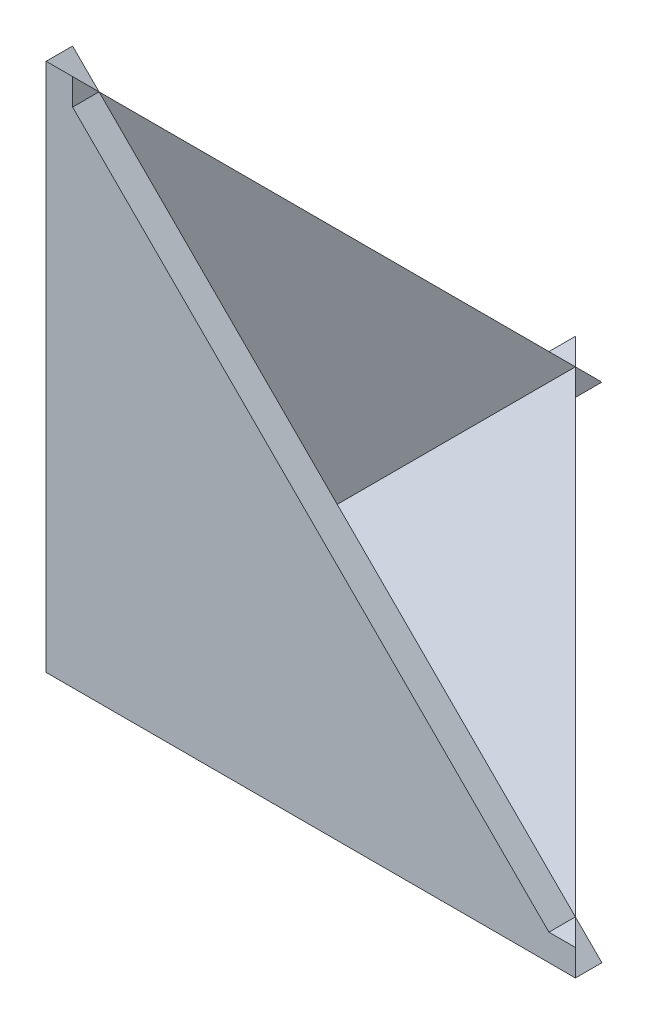
ISO-10303-21;
HEADER;
FILE_DESCRIPTION(('STEP AP214'),'2;1');
FILE_NAME('part.step','',(''),(''),'','','');
FILE_SCHEMA(('AUTOMOTIVE_DESIGN { 1 0 10303 214 1 1 1 1 }'));
ENDSEC;
DATA;
#1=APPLICATION_CONTEXT('core data for automotive mechanical design processes');
#2=APPLICATION_PROTOCOL_DEFINITION('international standard','automotive_design',2000,#1);
#3=PRODUCT_CONTEXT('',#1,'mechanical');
#4=PRODUCT('Part','Part','',(#3));
#5=PRODUCT_RELATED_PRODUCT_CATEGORY('part','',(#4));
#6=PRODUCT_DEFINITION_FORMATION('','',#4);
#7=PRODUCT_DEFINITION_CONTEXT('part definition',#1,'design');
#8=PRODUCT_DEFINITION('design','',#6,#7);
#9=PRODUCT_DEFINITION_SHAPE('','',#8);
#10=(LENGTH_UNIT() NAMED_UNIT(*) SI_UNIT(.MILLI.,.METRE.));
#11=(NAMED_UNIT(*) PLANE_ANGLE_UNIT() SI_UNIT($,.RADIAN.));
#12=(NAMED_UNIT(*) SI_UNIT($,.STERADIAN.) SOLID_ANGLE_UNIT());
#13=UNCERTAINTY_MEASURE_WITH_UNIT(LENGTH_MEASURE(1.E-05),#10,'distance_accuracy_value','');
#14=(GEOMETRIC_REPRESENTATION_CONTEXT(3) GLOBAL_UNCERTAINTY_ASSIGNED_CONTEXT((#13)) GLOBAL_UNIT_ASSIGNED_CONTEXT((#10,
#11,#12)) REPRESENTATION_CONTEXT('',''));
#15=CARTESIAN_POINT('',(0.,0.,0.));
#16=DIRECTION('',(0.,0.,1.));
#17=DIRECTION('',(1.,0.,0.));
#18=AXIS2_PLACEMENT_3D('',#15,#16,#17);
#19=CARTESIAN_POINT('',(10.,0.5,0.));
#20=DIRECTION('',(-0.707106781186547,0.,0.707106781186547));
#21=DIRECTION('',(0.707106781186548,0.,0.707106781186548));
#22=AXIS2_PLACEMENT_3D('',#19,#20,#21);
#23=PLANE('',#22);
#24=DIRECTION('',(0.,-1.,0.));
#25=VECTOR('',#24,1.);
#26=CARTESIAN_POINT('',(0.5,0.5,-9.5));
#27=LINE('',#26,#25);
#28=CARTESIAN_POINT('',(0.5,0.500000000000001,-9.5));
#29=VERTEX_POINT('',#28);
#30=CARTESIAN_POINT('',(0.5,0.,-9.5));
#31=VERTEX_POINT('',#30);
#32=EDGE_CURVE('E135',#29,#31,#27,.T.);
#33=ORIENTED_EDGE('',*,*,#32,.F.);
#34=DIRECTION('',(-0.707106781186548,0.,-0.707106781186548));
#35=VECTOR('',#34,1.);
#36=CARTESIAN_POINT('',(10.,0.5,0.));
#37=LINE('',#36,#35);
#38=CARTESIAN_POINT('',(9.5,0.500000000000001,-0.5));
#39=VERTEX_POINT('',#38);
#40=EDGE_CURVE('E189',#39,#29,#37,.T.);
#41=ORIENTED_EDGE('',*,*,#40,.F.);
#42=DIRECTION('',(0.,1.,0.));
#43=VECTOR('',#42,1.);
#44=CARTESIAN_POINT('',(9.5,0.5,-0.5));
#45=LINE('',#44,#43);
#46=CARTESIAN_POINT('',(9.5,0.,-0.500000000000001));
#47=VERTEX_POINT('',#46);
#48=EDGE_CURVE('E175',#47,#39,#45,.T.);
#49=ORIENTED_EDGE('',*,*,#48,.F.);
#50=DIRECTION('',(-0.707106781186548,0.,-0.707106781186548));
#51=VECTOR('',#50,1.);
#52=CARTESIAN_POINT('',(10.,0.,0.));
#53=LINE('',#52,#51);
#54=EDGE_CURVE('E184',#47,#31,#53,.T.);
#55=ORIENTED_EDGE('',*,*,#54,.T.);
#56=EDGE_LOOP('',(#33,#41,#49,#55));
#57=FACE_BOUND('',#56,.T.);
#58=ADVANCED_FACE('F30',(#57),#23,.F.);
#59=CARTESIAN_POINT('',(0.,0.5,-10.));
#60=DIRECTION('',(0.,1.,0.));
#61=DIRECTION('',(0.,0.,1.));
#62=AXIS2_PLACEMENT_3D('',#59,#60,#61);
#63=PLANE('',#62);
#64=ORIENTED_EDGE('',*,*,#40,.T.);
#65=DIRECTION('',(0.,0.,1.));
#66=VECTOR('',#65,1.);
#67=CARTESIAN_POINT('',(0.5,0.5,-10.));
#68=LINE('',#67,#66);
#69=CARTESIAN_POINT('',(0.5,0.5,-0.5));
#70=VERTEX_POINT('',#69);
#71=EDGE_CURVE('E146',#29,#70,#68,.T.);
#72=ORIENTED_EDGE('',*,*,#71,.T.);
#73=DIRECTION('',(1.,0.,0.));
#74=VECTOR('',#73,1.);
#75=CARTESIAN_POINT('',(0.,0.5,-0.5));
#76=LINE('',#75,#74);
#77=EDGE_CURVE('E53',#70,#39,#76,.T.);
#78=ORIENTED_EDGE('',*,*,#77,.T.);
#79=EDGE_LOOP('',(#64,#72,#78));
#80=FACE_BOUND('',#79,.T.);
#81=ADVANCED_FACE('F237',(#80),#63,.T.);
#82=CARTESIAN_POINT('',(0.,0.,-0.5));
#83=DIRECTION('',(0.,0.,1.));
#84=DIRECTION('',(1.,0.,0.));
#85=AXIS2_PLACEMENT_3D('',#82,#83,#84);
#86=PLANE('',#85);
#87=DIRECTION('',(0.,-1.,0.));
#88=VECTOR('',#87,1.);
#89=CARTESIAN_POINT('',(0.5,0.,-0.5));
#90=LINE('',#89,#88);
#91=CARTESIAN_POINT('',(0.5,9.5,-0.5));
#92=VERTEX_POINT('',#91);
#93=EDGE_CURVE('E143',#92,#70,#90,.T.);
#94=ORIENTED_EDGE('',*,*,#93,.F.);
#95=DIRECTION('',(-0.707106781186548,0.707106781186548,0.));
#96=VECTOR('',#95,1.);
#97=CARTESIAN_POINT('',(0.,10.,-0.5));
#98=LINE('',#97,#96);
#99=EDGE_CURVE('E163',#39,#92,#98,.T.);
#100=ORIENTED_EDGE('',*,*,#99,.F.);
#101=ORIENTED_EDGE('',*,*,#77,.F.);
#102=EDGE_LOOP('',(#94,#100,#101));
#103=FACE_BOUND('',#102,.T.);
#104=ADVANCED_FACE('F238',(#103),#86,.F.);
#105=CARTESIAN_POINT('',(0.,10.,-0.5));
#106=DIRECTION('',(0.707106781186547,0.707106781186547,0.));
#107=DIRECTION('',(-0.707106781186548,0.707106781186548,0.));
#108=AXIS2_PLACEMENT_3D('',#105,#106,#107);
#109=PLANE('',#108);
#110=ORIENTED_EDGE('',*,*,#99,.T.);
#111=DIRECTION('',(0.,0.,1.));
#112=VECTOR('',#111,1.);
#113=CARTESIAN_POINT('',(0.5,9.5,-0.5));
#114=LINE('',#113,#112);
#115=CARTESIAN_POINT('',(0.5,9.5,0.));
#116=VERTEX_POINT('',#115);
#117=EDGE_CURVE('E38',#92,#116,#114,.T.);
#118=ORIENTED_EDGE('',*,*,#117,.T.);
#119=DIRECTION('',(-0.707106781186548,0.707106781186548,0.));
#120=VECTOR('',#119,1.);
#121=CARTESIAN_POINT('',(0.,10.,0.));
#122=LINE('',#121,#120);
#123=CARTESIAN_POINT('',(9.5,0.500000000000001,0.));
#124=VERTEX_POINT('',#123);
#125=EDGE_CURVE('E155',#124,#116,#122,.T.);
#126=ORIENTED_EDGE('',*,*,#125,.F.);
#127=DIRECTION('',(0.,0.,-1.));
#128=VECTOR('',#127,1.);
#129=CARTESIAN_POINT('',(9.5,0.5,-10.));
#130=LINE('',#129,#128);
#131=EDGE_CURVE('E178',#124,#39,#130,.T.);
#132=ORIENTED_EDGE('',*,*,#131,.T.);
#133=EDGE_LOOP('',(#110,#118,#126,#132));
#134=FACE_BOUND('',#133,.T.);
#135=ADVANCED_FACE('F209',(#134),#109,.T.);
#136=CARTESIAN_POINT('',(0.,0.5,-10.));
#137=VERTEX_POINT('',#136);
#138=EDGE_CURVE('E190',#29,#137,#37,.T.);
#139=ORIENTED_EDGE('',*,*,#138,.F.);
#140=DIRECTION('',(-0.577350269189626,-0.577350269189626,-0.577350269189626));
#141=VECTOR('',#140,1.);
#142=CARTESIAN_POINT('',(6.83333333333333,6.83333333333333,-3.16666666666667));
#143=LINE('',#142,#141);
#144=CARTESIAN_POINT('',(0.,0.,-10.));
#145=VERTEX_POINT('',#144);
#146=EDGE_CURVE('E113',#29,#145,#143,.T.);
#147=ORIENTED_EDGE('',*,*,#146,.T.);
#148=DIRECTION('',(0.,-1.,0.));
#149=VECTOR('',#148,1.);
#150=CARTESIAN_POINT('',(0.,0.5,-10.));
#151=LINE('',#150,#149);
#152=EDGE_CURVE('E205',#137,#145,#151,.T.);
#153=ORIENTED_EDGE('',*,*,#152,.F.);
#154=EDGE_LOOP('',(#139,#147,#153));
#155=FACE_BOUND('',#154,.T.);
#156=ADVANCED_FACE('F230',(#155),#23,.F.);
#157=DIRECTION('',(-1.,0.,0.));
#158=VECTOR('',#157,1.);
#159=CARTESIAN_POINT('',(0.,0.5,-9.5));
#160=LINE('',#159,#158);
#161=CARTESIAN_POINT('',(0.,0.499999999999999,-9.5));
#162=VERTEX_POINT('',#161);
#163=EDGE_CURVE('E152',#29,#162,#160,.T.);
#164=ORIENTED_EDGE('',*,*,#163,.F.);
#165=ORIENTED_EDGE('',*,*,#138,.T.);
#166=DIRECTION('',(0.,0.,1.));
#167=VECTOR('',#166,1.);
#168=CARTESIAN_POINT('',(0.,0.5,-10.));
#169=LINE('',#168,#167);
#170=EDGE_CURVE('E188',#137,#162,#169,.T.);
#171=ORIENTED_EDGE('',*,*,#170,.T.);
#172=EDGE_LOOP('',(#164,#165,#171));
#173=FACE_BOUND('',#172,.T.);
#174=ADVANCED_FACE('F225',(#173),#63,.T.);
#175=DIRECTION('',(0.,-1.,0.));
#176=VECTOR('',#175,1.);
#177=CARTESIAN_POINT('',(10.,0.5,0.));
#178=LINE('',#177,#176);
#179=CARTESIAN_POINT('',(10.,0.5,0.));
#180=VERTEX_POINT('',#179);
#181=CARTESIAN_POINT('',(10.,0.,0.));
#182=VERTEX_POINT('',#181);
#183=EDGE_CURVE('E195',#180,#182,#178,.T.);
#184=ORIENTED_EDGE('',*,*,#183,.T.);
#185=DIRECTION('',(-0.577350269189626,0.577350269189626,-0.577350269189626));
#186=VECTOR('',#185,1.);
#187=CARTESIAN_POINT('',(9.83333333333333,0.166666666666667,-0.166666666666667));
#188=LINE('',#187,#186);
#189=EDGE_CURVE('E181',#182,#39,#188,.T.);
#190=ORIENTED_EDGE('',*,*,#189,.T.);
#191=EDGE_CURVE('E185',#180,#39,#37,.T.);
#192=ORIENTED_EDGE('',*,*,#191,.F.);
#193=EDGE_LOOP('',(#184,#190,#192));
#194=FACE_BOUND('',#193,.T.);
#195=ADVANCED_FACE('F32',(#194),#23,.F.);
#196=CARTESIAN_POINT('',(0.,0.5,-10.));
#197=DIRECTION('',(1.,0.,0.));
#198=DIRECTION('',(0.,0.,-1.));
#199=AXIS2_PLACEMENT_3D('',#196,#197,#198);
#200=PLANE('',#199);
#201=DIRECTION('',(0.,-1.,0.));
#202=VECTOR('',#201,1.);
#203=CARTESIAN_POINT('',(0.,0.,-0.5));
#204=LINE('',#203,#202);
#205=CARTESIAN_POINT('',(0.,10.,-0.5));
#206=VERTEX_POINT('',#205);
#207=CARTESIAN_POINT('',(0.,9.5,-0.5));
#208=VERTEX_POINT('',#207);
#209=EDGE_CURVE('E162',#206,#208,#204,.T.);
#210=ORIENTED_EDGE('',*,*,#209,.T.);
#211=DIRECTION('',(0.,-0.707106781186548,-0.707106781186548));
#212=VECTOR('',#211,1.);
#213=CARTESIAN_POINT('',(0.,10.,0.));
#214=LINE('',#213,#212);
#215=EDGE_CURVE('E118',#208,#162,#214,.T.);
#216=ORIENTED_EDGE('',*,*,#215,.T.);
#217=ORIENTED_EDGE('',*,*,#170,.F.);
#218=ORIENTED_EDGE('',*,*,#152,.T.);
#219=DIRECTION('',(0.,0.,1.));
#220=VECTOR('',#219,1.);
#221=CARTESIAN_POINT('',(0.,0.,-10.));
#222=LINE('',#221,#220);
#223=CARTESIAN_POINT('',(0.,0.,0.));
#224=VERTEX_POINT('',#223);
#225=EDGE_CURVE('E129',#145,#224,#222,.T.);
#226=ORIENTED_EDGE('',*,*,#225,.T.);
#227=DIRECTION('',(0.,-1.,0.));
#228=VECTOR('',#227,1.);
#229=CARTESIAN_POINT('',(0.,0.5,0.));
#230=LINE('',#229,#228);
#231=CARTESIAN_POINT('',(0.,10.,0.));
#232=VERTEX_POINT('',#231);
#233=EDGE_CURVE('E202',#232,#224,#230,.T.);
#234=ORIENTED_EDGE('',*,*,#233,.F.);
#235=DIRECTION('',(0.,0.,1.));
#236=VECTOR('',#235,1.);
#237=CARTESIAN_POINT('',(0.,10.,-0.5));
#238=LINE('',#237,#236);
#239=EDGE_CURVE('E169',#206,#232,#238,.T.);
#240=ORIENTED_EDGE('',*,*,#239,.F.);
#241=EDGE_LOOP('',(#210,#216,#217,#218,#226,#234,#240));
#242=FACE_BOUND('',#241,.T.);
#243=ADVANCED_FACE('F229',(#242),#200,.F.);
#244=CARTESIAN_POINT('',(0.,0.5,0.));
#245=DIRECTION('',(0.,0.,-1.));
#246=DIRECTION('',(-1.,0.,0.));
#247=AXIS2_PLACEMENT_3D('',#244,#245,#246);
#248=PLANE('',#247);
#249=DIRECTION('',(1.,0.,0.));
#250=VECTOR('',#249,1.);
#251=CARTESIAN_POINT('',(0.,0.,0.));
#252=LINE('',#251,#250);
#253=EDGE_CURVE('E198',#224,#182,#252,.T.);
#254=ORIENTED_EDGE('',*,*,#253,.T.);
#255=ORIENTED_EDGE('',*,*,#183,.F.);
#256=DIRECTION('',(1.,0.,0.));
#257=VECTOR('',#256,1.);
#258=CARTESIAN_POINT('',(0.,0.5,0.));
#259=LINE('',#258,#257);
#260=EDGE_CURVE('E193',#124,#180,#259,.T.);
#261=ORIENTED_EDGE('',*,*,#260,.F.);
#262=ORIENTED_EDGE('',*,*,#125,.T.);
#263=DIRECTION('',(0.,1.,0.));
#264=VECTOR('',#263,1.);
#265=CARTESIAN_POINT('',(0.5,0.,0.));
#266=LINE('',#265,#264);
#267=CARTESIAN_POINT('',(0.5,10.,0.));
#268=VERTEX_POINT('',#267);
#269=EDGE_CURVE('E45',#116,#268,#266,.T.);
#270=ORIENTED_EDGE('',*,*,#269,.T.);
#271=DIRECTION('',(-1.,0.,0.));
#272=VECTOR('',#271,1.);
#273=CARTESIAN_POINT('',(0.5,10.,0.));
#274=LINE('',#273,#272);
#275=EDGE_CURVE('E131',#268,#232,#274,.T.);
#276=ORIENTED_EDGE('',*,*,#275,.T.);
#277=ORIENTED_EDGE('',*,*,#233,.T.);
#278=EDGE_LOOP('',(#254,#255,#261,#262,#270,#276,#277));
#279=FACE_BOUND('',#278,.T.);
#280=ADVANCED_FACE('F212',(#279),#248,.F.);
#281=ORIENTED_EDGE('',*,*,#131,.F.);
#282=ORIENTED_EDGE('',*,*,#260,.T.);
#283=ORIENTED_EDGE('',*,*,#191,.T.);
#284=EDGE_LOOP('',(#281,#282,#283));
#285=FACE_BOUND('',#284,.T.);
#286=ADVANCED_FACE('F218',(#285),#63,.T.);
#287=CARTESIAN_POINT('',(0.,0.,-10.));
#288=DIRECTION('',(0.,1.,0.));
#289=DIRECTION('',(0.,0.,1.));
#290=AXIS2_PLACEMENT_3D('',#287,#288,#289);
#291=PLANE('',#290);
#292=ORIENTED_EDGE('',*,*,#225,.F.);
#293=DIRECTION('',(-1.,0.,0.));
#294=VECTOR('',#293,1.);
#295=CARTESIAN_POINT('',(0.5,0.,-10.));
#296=LINE('',#295,#294);
#297=CARTESIAN_POINT('',(0.5,0.,-10.));
#298=VERTEX_POINT('',#297);
#299=EDGE_CURVE('E111',#298,#145,#296,.T.);
#300=ORIENTED_EDGE('',*,*,#299,.F.);
#301=DIRECTION('',(0.,0.,1.));
#302=VECTOR('',#301,1.);
#303=CARTESIAN_POINT('',(0.5,0.,-10.));
#304=LINE('',#303,#302);
#305=EDGE_CURVE('E126',#298,#31,#304,.T.);
#306=ORIENTED_EDGE('',*,*,#305,.T.);
#307=ORIENTED_EDGE('',*,*,#54,.F.);
#308=DIRECTION('',(1.,0.,0.));
#309=VECTOR('',#308,1.);
#310=CARTESIAN_POINT('',(0.,0.,-0.5));
#311=LINE('',#310,#309);
#312=CARTESIAN_POINT('',(10.,0.,-0.5));
#313=VERTEX_POINT('',#312);
#314=EDGE_CURVE('E156',#47,#313,#311,.T.);
#315=ORIENTED_EDGE('',*,*,#314,.T.);
#316=DIRECTION('',(0.,0.,1.));
#317=VECTOR('',#316,1.);
#318=CARTESIAN_POINT('',(10.,0.,-0.5));
#319=LINE('',#318,#317);
#320=EDGE_CURVE('E166',#313,#182,#319,.T.);
#321=ORIENTED_EDGE('',*,*,#320,.T.);
#322=ORIENTED_EDGE('',*,*,#253,.F.);
#323=EDGE_LOOP('',(#292,#300,#306,#307,#315,#321,#322));
#324=FACE_BOUND('',#323,.T.);
#325=ADVANCED_FACE('F124',(#324),#291,.F.);
#326=EDGE_CURVE('E158',#92,#206,#98,.T.);
#327=ORIENTED_EDGE('',*,*,#326,.F.);
#328=DIRECTION('',(-1.,0.,0.));
#329=VECTOR('',#328,1.);
#330=CARTESIAN_POINT('',(0.,9.5,-0.5));
#331=LINE('',#330,#329);
#332=EDGE_CURVE('E149',#92,#208,#331,.T.);
#333=ORIENTED_EDGE('',*,*,#332,.T.);
#334=ORIENTED_EDGE('',*,*,#209,.F.);
#335=EDGE_LOOP('',(#327,#333,#334));
#336=FACE_BOUND('',#335,.T.);
#337=ADVANCED_FACE('F254',(#336),#86,.F.);
#338=DIRECTION('',(-0.577350269189626,0.577350269189626,0.577350269189626));
#339=VECTOR('',#338,1.);
#340=CARTESIAN_POINT('',(0.166666666666667,9.83333333333333,-0.166666666666667));
#341=LINE('',#340,#339);
#342=EDGE_CURVE('E11',#92,#232,#341,.T.);
#343=ORIENTED_EDGE('',*,*,#342,.F.);
#344=ORIENTED_EDGE('',*,*,#326,.T.);
#345=ORIENTED_EDGE('',*,*,#239,.T.);
#346=EDGE_LOOP('',(#343,#344,#345));
#347=FACE_BOUND('',#346,.T.);
#348=ADVANCED_FACE('F241',(#347),#109,.T.);
#349=ORIENTED_EDGE('',*,*,#189,.F.);
#350=ORIENTED_EDGE('',*,*,#320,.F.);
#351=EDGE_CURVE('E159',#313,#39,#98,.T.);
#352=ORIENTED_EDGE('',*,*,#351,.T.);
#353=EDGE_LOOP('',(#349,#350,#352));
#354=FACE_BOUND('',#353,.T.);
#355=ADVANCED_FACE('F240',(#354),#109,.T.);
#356=ORIENTED_EDGE('',*,*,#314,.F.);
#357=ORIENTED_EDGE('',*,*,#48,.T.);
#358=ORIENTED_EDGE('',*,*,#351,.F.);
#359=EDGE_LOOP('',(#356,#357,#358));
#360=FACE_BOUND('',#359,.T.);
#361=ADVANCED_FACE('F253',(#360),#86,.F.);
#362=CARTESIAN_POINT('',(0.5,0.,-10.));
#363=DIRECTION('',(-1.,0.,0.));
#364=DIRECTION('',(0.,0.,1.));
#365=AXIS2_PLACEMENT_3D('',#362,#363,#364);
#366=PLANE('',#365);
#367=ORIENTED_EDGE('',*,*,#117,.F.);
#368=DIRECTION('',(0.,-0.707106781186548,-0.707106781186548));
#369=VECTOR('',#368,1.);
#370=CARTESIAN_POINT('',(0.5,10.,0.));
#371=LINE('',#370,#369);
#372=EDGE_CURVE('E120',#268,#92,#371,.T.);
#373=ORIENTED_EDGE('',*,*,#372,.F.);
#374=ORIENTED_EDGE('',*,*,#269,.F.);
#375=EDGE_LOOP('',(#367,#373,#374));
#376=FACE_BOUND('',#375,.T.);
#377=ADVANCED_FACE('F310',(#376),#366,.F.);
#378=CARTESIAN_POINT('',(0.5,10.,0.));
#379=DIRECTION('',(0.,0.707106781186547,-0.707106781186547));
#380=DIRECTION('',(0.,0.707106781186548,0.707106781186548));
#381=AXIS2_PLACEMENT_3D('',#378,#379,#380);
#382=PLANE('',#381);
#383=ORIENTED_EDGE('',*,*,#372,.T.);
#384=ORIENTED_EDGE('',*,*,#342,.T.);
#385=ORIENTED_EDGE('',*,*,#275,.F.);
#386=EDGE_LOOP('',(#383,#384,#385));
#387=FACE_BOUND('',#386,.T.);
#388=ADVANCED_FACE('F363',(#387),#382,.T.);
#389=ORIENTED_EDGE('',*,*,#71,.F.);
#390=EDGE_CURVE('E117',#92,#29,#371,.T.);
#391=ORIENTED_EDGE('',*,*,#390,.F.);
#392=ORIENTED_EDGE('',*,*,#93,.T.);
#393=EDGE_LOOP('',(#389,#391,#392));
#394=FACE_BOUND('',#393,.T.);
#395=ADVANCED_FACE('F365',(#394),#366,.F.);
#396=ORIENTED_EDGE('',*,*,#390,.T.);
#397=ORIENTED_EDGE('',*,*,#163,.T.);
#398=ORIENTED_EDGE('',*,*,#215,.F.);
#399=ORIENTED_EDGE('',*,*,#332,.F.);
#400=EDGE_LOOP('',(#396,#397,#398,#399));
#401=FACE_BOUND('',#400,.T.);
#402=ADVANCED_FACE('F375',(#401),#382,.T.);
#403=ORIENTED_EDGE('',*,*,#146,.F.);
#404=EDGE_CURVE('E108',#29,#298,#371,.T.);
#405=ORIENTED_EDGE('',*,*,#404,.T.);
#406=ORIENTED_EDGE('',*,*,#299,.T.);
#407=EDGE_LOOP('',(#403,#405,#406));
#408=FACE_BOUND('',#407,.T.);
#409=ADVANCED_FACE('F110',(#408),#382,.T.);
#410=ORIENTED_EDGE('',*,*,#404,.F.);
#411=ORIENTED_EDGE('',*,*,#32,.T.);
#412=ORIENTED_EDGE('',*,*,#305,.F.);
#413=EDGE_LOOP('',(#410,#411,#412));
#414=FACE_BOUND('',#413,.T.);
#415=ADVANCED_FACE('F133',(#414),#366,.F.);
#416=CLOSED_SHELL('',(#58,#81,#104,#135,#156,#174,#195,#243,#280,#286,#325,#337,#348,#355,#361,
#377,#388,#395,#402,#409,#415));
#417=MANIFOLD_SOLID_BREP('B2',#416);
#418=ADVANCED_BREP_SHAPE_REPRESENTATION('',(#18,#417),#14);
#419=SHAPE_DEFINITION_REPRESENTATION(#9,#418);
ENDSEC;
END-ISO-10303-21;
